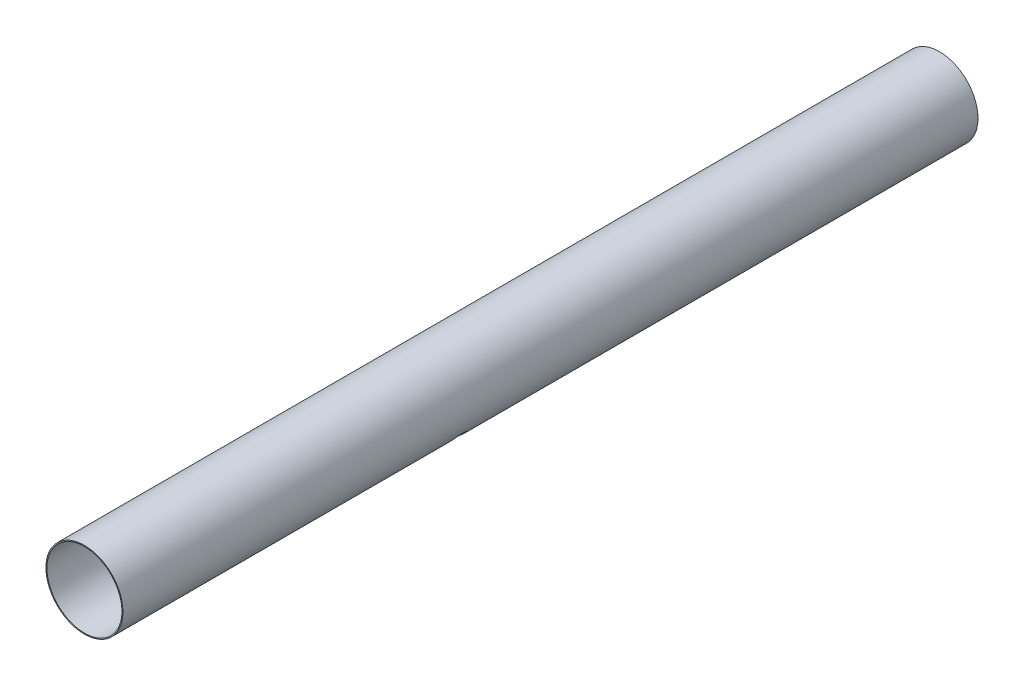
ISO-10303-21;
HEADER;
FILE_DESCRIPTION(('STEP AP214'),'2;1');
FILE_NAME('part.step','',(''),(''),'','','');
FILE_SCHEMA(('AUTOMOTIVE_DESIGN { 1 0 10303 214 1 1 1 1 }'));
ENDSEC;
DATA;
#1=APPLICATION_CONTEXT('core data for automotive mechanical design processes');
#2=APPLICATION_PROTOCOL_DEFINITION('international standard','automotive_design',2000,#1);
#3=PRODUCT_CONTEXT('',#1,'mechanical');
#4=PRODUCT('Part','Part','',(#3));
#5=PRODUCT_RELATED_PRODUCT_CATEGORY('part','',(#4));
#6=PRODUCT_DEFINITION_FORMATION('','',#4);
#7=PRODUCT_DEFINITION_CONTEXT('part definition',#1,'design');
#8=PRODUCT_DEFINITION('design','',#6,#7);
#9=PRODUCT_DEFINITION_SHAPE('','',#8);
#10=(LENGTH_UNIT() NAMED_UNIT(*) SI_UNIT(.MILLI.,.METRE.));
#11=(NAMED_UNIT(*) PLANE_ANGLE_UNIT() SI_UNIT($,.RADIAN.));
#12=(NAMED_UNIT(*) SI_UNIT($,.STERADIAN.) SOLID_ANGLE_UNIT());
#13=UNCERTAINTY_MEASURE_WITH_UNIT(LENGTH_MEASURE(1.E-05),#10,'distance_accuracy_value','');
#14=(GEOMETRIC_REPRESENTATION_CONTEXT(3) GLOBAL_UNCERTAINTY_ASSIGNED_CONTEXT((#13)) GLOBAL_UNIT_ASSIGNED_CONTEXT((#10,
#11,#12)) REPRESENTATION_CONTEXT('',''));
#15=CARTESIAN_POINT('',(0.,0.,0.));
#16=DIRECTION('',(0.,0.,1.));
#17=DIRECTION('',(1.,0.,0.));
#18=AXIS2_PLACEMENT_3D('',#15,#16,#17);
#19=CARTESIAN_POINT('',(0.,0.,1740.));
#20=DIRECTION('',(0.,0.,-1.));
#21=DIRECTION('',(-1.,0.,0.));
#22=AXIS2_PLACEMENT_3D('',#19,#20,#21);
#23=CYLINDRICAL_SURFACE('',#22,78.35);
#24=CARTESIAN_POINT('',(0.,0.,1740.));
#25=DIRECTION('',(0.,0.,1.));
#26=DIRECTION('',(1.,0.,0.));
#27=AXIS2_PLACEMENT_3D('',#24,#25,#26);
#28=CIRCLE('',#27,78.35);
#29=CARTESIAN_POINT('',(78.35,0.,1740.));
#30=VERTEX_POINT('',#29);
#31=EDGE_CURVE('E10',#30,#30,#28,.T.);
#32=ORIENTED_EDGE('',*,*,#31,.F.);
#33=EDGE_LOOP('',(#32));
#34=FACE_BOUND('',#33,.T.);
#35=CARTESIAN_POINT('',(0.,0.,0.));
#36=DIRECTION('',(0.,0.,1.));
#37=DIRECTION('',(1.,0.,0.));
#38=AXIS2_PLACEMENT_3D('',#35,#36,#37);
#39=CIRCLE('',#38,78.35);
#40=CARTESIAN_POINT('',(78.35,0.,0.));
#41=VERTEX_POINT('',#40);
#42=EDGE_CURVE('E44',#41,#41,#39,.T.);
#43=ORIENTED_EDGE('',*,*,#42,.T.);
#44=EDGE_LOOP('',(#43));
#45=FACE_BOUND('',#44,.T.);
#46=CARTESIAN_POINT('',(43.7704269799894,-64.9836304155855,1034.89));
#47=CARTESIAN_POINT('',(43.7704185873971,-64.9836330495455,1034.47274378583));
#48=CARTESIAN_POINT('',(43.7851471420884,-64.9737219518035,1034.05558703219));
#49=CARTESIAN_POINT('',(43.8438763845193,-64.9341078192532,1033.22415873229));
#50=CARTESIAN_POINT('',(43.8878822551469,-64.9044012801074,1032.80988771003));
#51=CARTESIAN_POINT('',(44.0047211961866,-64.8252416643284,1031.9870345879));
#52=CARTESIAN_POINT('',(44.0775760797465,-64.7757736455095,1031.5784570355));
#53=CARTESIAN_POINT('',(44.2512835874142,-64.6572304527577,1030.77021365579));
#54=CARTESIAN_POINT('',(44.3521350241034,-64.5881561103856,1030.3705474513));
#55=CARTESIAN_POINT('',(44.5806165403686,-64.4306630565429,1029.58328380249));
#56=CARTESIAN_POINT('',(44.7082210702476,-64.3422627982597,1029.1956752456));
#57=CARTESIAN_POINT('',(44.9889025976642,-64.1463203743606,1028.43478423851));
#58=CARTESIAN_POINT('',(45.1419798411203,-64.0387780239428,1028.06150192667));
#59=CARTESIAN_POINT('',(45.4720052838104,-63.8048596741469,1027.33182074178));
#60=CARTESIAN_POINT('',(45.6489512381604,-63.6784854458149,1026.97542028522));
#61=CARTESIAN_POINT('',(46.0249546498748,-63.4072532475293,1026.28183633831));
#62=CARTESIAN_POINT('',(46.22401226693,-63.2623951440836,1025.94465298677));
#63=CARTESIAN_POINT('',(46.6447482231952,-62.9528310910909,1025.2879311708));
#64=CARTESIAN_POINT('',(46.866662744575,-62.7879138793412,1024.96864356115));
#65=CARTESIAN_POINT('',(47.3290238003795,-62.4401286523775,1024.35417088082));
#66=CARTESIAN_POINT('',(47.5694704799832,-62.2572604965347,1024.05898599899));
#67=CARTESIAN_POINT('',(48.0666736530319,-61.8741937594589,1023.49470862881));
#68=CARTESIAN_POINT('',(48.3234312126405,-61.6739940450346,1023.22561784902));
#69=CARTESIAN_POINT('',(48.8509126361228,-61.2570309143429,1022.71540798926));
#70=CARTESIAN_POINT('',(49.1216365312667,-61.0402674609894,1022.47428897192));
#71=CARTESIAN_POINT('',(49.6768578962189,-60.5892828403475,1022.01991550933));
#72=CARTESIAN_POINT('',(49.9614480331917,-60.3549361732006,1021.80689875727));
#73=CARTESIAN_POINT('',(50.5398647024458,-59.8714175867554,1021.41257831312));
#74=CARTESIAN_POINT('',(50.8336912991311,-59.6222455640719,1021.23127484222));
#75=CARTESIAN_POINT('',(51.4280088291381,-59.1103728987661,1020.9017646628));
#76=CARTESIAN_POINT('',(51.7284993191694,-58.8476731544965,1020.75355576001));
#77=CARTESIAN_POINT('',(52.3335995984996,-58.3102099300419,1020.49137426413));
#78=CARTESIAN_POINT('',(52.6382093327444,-58.0354466109777,1020.37740121395));
#79=CARTESIAN_POINT('',(53.245308675188,-57.4789275572815,1020.18576577491));
#80=CARTESIAN_POINT('',(53.547779331399,-57.197296678722,1020.10768066527));
#81=CARTESIAN_POINT('',(54.1518585249759,-56.6257150790329,1019.98642797146));
#82=CARTESIAN_POINT('',(54.4534670685888,-56.3357644183578,1019.94326013364));
#83=CARTESIAN_POINT('',(55.0534780831228,-55.7495555996889,1019.89219125522));
#84=CARTESIAN_POINT('',(55.3518808015405,-55.4532979339519,1019.88428747235));
#85=CARTESIAN_POINT('',(55.9432971276282,-54.8565990368764,1019.90380344009));
#86=CARTESIAN_POINT('',(56.2363107736518,-54.5561578353385,1019.93122293921));
#87=CARTESIAN_POINT('',(56.8111014170381,-53.9573096530345,1020.02057391802));
#88=CARTESIAN_POINT('',(57.092975243934,-53.658927441316,1020.08204943961));
#89=CARTESIAN_POINT('',(57.6476434795243,-53.0625812387903,1020.23870859702));
#90=CARTESIAN_POINT('',(57.9204379804708,-52.7646172437633,1020.33389189025));
#91=CARTESIAN_POINT('',(58.4553102185501,-52.1714358133198,1020.55724022727));
#92=CARTESIAN_POINT('',(58.7173876906627,-51.8762184459636,1020.68540608612));
#93=CARTESIAN_POINT('',(59.2293587223791,-51.2909033059705,1020.97375915673));
#94=CARTESIAN_POINT('',(59.4792521727391,-51.0008055792519,1021.13394665554));
#95=CARTESIAN_POINT('',(59.9669944206552,-50.4264303080915,1021.48620002339));
#96=CARTESIAN_POINT('',(60.2047644088533,-50.1421966141301,1021.67844649017));
#97=CARTESIAN_POINT('',(60.665559351662,-49.5837018978869,1022.0927734451));
#98=CARTESIAN_POINT('',(60.8885842723433,-49.3094408985535,1022.3148540019));
#99=CARTESIAN_POINT('',(61.3189526135695,-48.7732177545314,1022.78731940969));
#100=CARTESIAN_POINT('',(61.5262946367326,-48.511256706583,1023.03770677794));
#101=CARTESIAN_POINT('',(61.9244690796638,-48.0019493216069,1023.56506316975));
#102=CARTESIAN_POINT('',(62.11530131504,-47.7546031478173,1023.84203249012));
#103=CARTESIAN_POINT('',(62.48269425138,-47.2729166797975,1024.42533107783));
#104=CARTESIAN_POINT('',(62.6589777936026,-47.0388477603642,1024.73205916109));
#105=CARTESIAN_POINT('',(62.9932060883876,-46.5903073447042,1025.36894660709));
#106=CARTESIAN_POINT('',(63.1511506356771,-46.3758360678444,1025.69910623204));
#107=CARTESIAN_POINT('',(63.4482057053387,-45.9685897220004,1026.38061505639));
#108=CARTESIAN_POINT('',(63.5873158241913,-45.7758151178731,1026.73196470955));
#109=CARTESIAN_POINT('',(63.8462817978858,-45.413922227383,1027.45344340361));
#110=CARTESIAN_POINT('',(63.966137724388,-45.2448038529769,1027.82357237462));
#111=CARTESIAN_POINT('',(64.1864541208828,-44.9317075208343,1028.58075356351));
#112=CARTESIAN_POINT('',(64.286878326303,-44.7877766163121,1028.96783580128));
#113=CARTESIAN_POINT('',(64.4677699594066,-44.527006845484,1029.75555842047));
#114=CARTESIAN_POINT('',(64.5482373263192,-44.4101680616766,1030.15619884318));
#115=CARTESIAN_POINT('',(64.6889807584611,-44.2049066248782,1030.96812481877));
#116=CARTESIAN_POINT('',(64.7492587836656,-44.1164812135593,1031.37940933416));
#117=CARTESIAN_POINT('',(64.8494628526782,-43.969053071203,1032.20965875243));
#118=CARTESIAN_POINT('',(64.889389194602,-43.9100499091825,1032.62862354273));
#119=CARTESIAN_POINT('',(64.9483106087706,-43.8228499087805,1033.46451418495));
#120=CARTESIAN_POINT('',(64.967624677493,-43.7941836355311,1033.88136865493));
#121=CARTESIAN_POINT('',(64.9863732776753,-43.7663577942352,1034.71650533041));
#122=CARTESIAN_POINT('',(64.9858080161588,-43.7671979189085,1035.13478752099));
#123=CARTESIAN_POINT('',(64.9648003499233,-43.798373998858,1035.9697284803));
#124=CARTESIAN_POINT('',(64.944358911118,-43.8287085208083,1036.38638732694));
#125=CARTESIAN_POINT('',(64.8836569747425,-43.9185210146455,1037.21509276142));
#126=CARTESIAN_POINT('',(64.8433965141776,-43.9779989321169,1037.62713935787));
#127=CARTESIAN_POINT('',(64.7436038359295,-44.1247782156928,1038.44011964087));
#128=CARTESIAN_POINT('',(64.6842421075908,-44.2118333370536,1038.84111877799));
#129=CARTESIAN_POINT('',(64.5463126688734,-44.4129584097913,1039.6329024085));
#130=CARTESIAN_POINT('',(64.4677451038635,-44.5270281566947,1040.02368697919));
#131=CARTESIAN_POINT('',(64.2916098179147,-44.780969918088,1040.79240025617));
#132=CARTESIAN_POINT('',(64.1940409875417,-44.9208434391676,1041.17032821029));
#133=CARTESIAN_POINT('',(63.9801690916804,-45.2249377742064,1041.91077321018));
#134=CARTESIAN_POINT('',(63.8638657949113,-45.3891588887397,1042.27329006562));
#135=CARTESIAN_POINT('',(63.6113369759639,-45.742409103598,1042.98476310828));
#136=CARTESIAN_POINT('',(63.4748890542312,-45.9317123499956,1043.33350426041));
#137=CARTESIAN_POINT('',(63.183531309086,-46.3316853279084,1044.01041350401));
#138=CARTESIAN_POINT('',(63.0286213599965,-46.5423552048715,1044.33858145541));
#139=CARTESIAN_POINT('',(62.7008011967971,-46.9830547317894,1044.97218364948));
#140=CARTESIAN_POINT('',(62.5278895002713,-47.2130859758234,1045.27761601636));
#141=CARTESIAN_POINT('',(62.164643889968,-47.6903497719131,1045.86367680086));
#142=CARTESIAN_POINT('',(61.9743098424962,-47.9375824559646,1046.14430502811));
#143=CARTESIAN_POINT('',(61.5741140011588,-48.450575454638,1046.68260390098));
#144=CARTESIAN_POINT('',(61.3640161995441,-48.7165466369921,1046.93989830056));
#145=CARTESIAN_POINT('',(60.9274463683985,-49.2614518269188,1047.42521369087));
#146=CARTESIAN_POINT('',(60.7009741656431,-49.5403859716152,1047.65323437183));
#147=CARTESIAN_POINT('',(60.2326658587224,-50.1087219554688,1048.07834258799));
#148=CARTESIAN_POINT('',(59.9908301565177,-50.3981235206779,1048.27543093201));
#149=CARTESIAN_POINT('',(59.4929730978826,-50.9848669652262,1048.63721155927));
#150=CARTESIAN_POINT('',(59.2369518744444,-51.2822087701104,1048.80190414616));
#151=CARTESIAN_POINT('',(58.7135189146999,-51.8806549233496,1049.09683237367));
#152=CARTESIAN_POINT('',(58.4461762930448,-52.1817302143447,1049.22724960319));
#153=CARTESIAN_POINT('',(57.9003697360255,-52.7866994543221,1049.45377518911));
#154=CARTESIAN_POINT('',(57.6219058232164,-53.0905933975869,1049.54988361509));
#155=CARTESIAN_POINT('',(57.0556335485241,-53.6986942847747,1049.70701823441));
#156=CARTESIAN_POINT('',(56.7678260491143,-54.0029011973127,1049.76804765611));
#157=CARTESIAN_POINT('',(56.1847831404379,-54.6092439673635,1049.85454247988));
#158=CARTESIAN_POINT('',(55.8895478213747,-54.9113798499702,1049.88000831364));
#159=CARTESIAN_POINT('',(55.2985208269948,-55.5064784673629,1049.89504850272));
#160=CARTESIAN_POINT('',(55.0028133338795,-55.7995106403069,1049.88518955052));
#161=CARTESIAN_POINT('',(54.4083996751838,-56.3792594897203,1049.8309143007));
#162=CARTESIAN_POINT('',(54.109693543779,-56.6659762380481,1049.78649839648));
#163=CARTESIAN_POINT('',(53.5115427939242,-57.2311681035575,1049.66346097936));
#164=CARTESIAN_POINT('',(53.2120981868208,-57.5096433465259,1049.58483998881));
#165=CARTESIAN_POINT('',(52.6147982971133,-58.0566059677918,1049.39400422158));
#166=CARTESIAN_POINT('',(52.3169430203181,-58.3250933096052,1049.28178932221));
#167=CARTESIAN_POINT('',(51.7257759733395,-58.8500005667144,1049.02487128859));
#168=CARTESIAN_POINT('',(51.4324565260323,-59.1064428294011,1048.88023144578));
#169=CARTESIAN_POINT('',(50.8521555713531,-59.6064382243742,1048.55941406077));
#170=CARTESIAN_POINT('',(50.5651740448707,-59.8499913955278,1048.38323661367));
#171=CARTESIAN_POINT('',(49.9999059203313,-60.3230284209334,1048.0006042255));
#172=CARTESIAN_POINT('',(49.7216197760019,-60.5525115416054,1047.79414770765));
#173=CARTESIAN_POINT('',(49.176097847303,-60.9963734755033,1047.35241114154));
#174=CARTESIAN_POINT('',(48.908862195132,-61.210752108054,1047.11713074859));
#175=CARTESIAN_POINT('',(48.3838536068781,-61.6266097850768,1046.61564708244));
#176=CARTESIAN_POINT('',(48.1262807392163,-61.8278493137863,1046.34903564299));
#177=CARTESIAN_POINT('',(47.6272042768601,-62.2131120952495,1045.78961681325));
#178=CARTESIAN_POINT('',(47.3857008790353,-62.3971351370924,1045.49680910213));
#179=CARTESIAN_POINT('',(46.9209475252783,-62.7473656081468,1044.88691462706));
#180=CARTESIAN_POINT('',(46.6977018791185,-62.913568833824,1044.56982216466));
#181=CARTESIAN_POINT('',(46.2716602648854,-63.2275731561657,1043.91356017449));
#182=CARTESIAN_POINT('',(46.068864135551,-63.3753743979471,1043.57439082084));
#183=CARTESIAN_POINT('',(45.6838482919443,-63.6534796786702,1042.87285045492));
#184=CARTESIAN_POINT('',(45.5018484396779,-63.7835990997252,1042.51028549335));
#185=CARTESIAN_POINT('',(45.1626286266663,-64.0242355518478,1041.76748997904));
#186=CARTESIAN_POINT('',(45.0054086126821,-64.1347526250306,1041.38725946427));
#187=CARTESIAN_POINT('',(44.7175567944082,-64.335786715727,1040.61210047453));
#188=CARTESIAN_POINT('',(44.5869033089367,-64.4263200473564,1040.21718429858));
#189=CARTESIAN_POINT('',(44.3535033462876,-64.5872221257257,1039.4153232428));
#190=CARTESIAN_POINT('',(44.250751304257,-64.6575948935794,1039.00838077955));
#191=CARTESIAN_POINT('',(44.0329706670176,-64.8062118515977,1037.99239799378));
#192=CARTESIAN_POINT('',(43.9347109637275,-64.872720213305,1037.37792555308));
#193=CARTESIAN_POINT('',(43.8034463565135,-64.961426874592,1036.13889431718));
#194=CARTESIAN_POINT('',(43.7704395377316,-64.9836264744206,1035.51433581849));
#195=CARTESIAN_POINT('',(43.7704269799894,-64.9836304155855,1034.89));
#196=B_SPLINE_CURVE_WITH_KNOTS('',3,(#46,#47,#48,#49,#50,#51,#52,#53,#54,#55,#56,#57,#58,#59,
#60,#61,#62,#63,#64,#65,#66,#67,#68,#69,#70,#71,#72,#73,#74,#75,#76,#77,#78,#79,#80,#81,#82,#83,
#84,#85,#86,#87,#88,#89,#90,#91,#92,#93,#94,#95,#96,#97,#98,#99,#100,#101,#102,#103,#104,#105,
#106,#107,#108,#109,#110,#111,#112,#113,#114,#115,#116,#117,#118,#119,#120,#121,#122,#123,#124,
#125,#126,#127,#128,#129,#130,#131,#132,#133,#134,#135,#136,#137,#138,#139,#140,#141,#142,#143,
#144,#145,#146,#147,#148,#149,#150,#151,#152,#153,#154,#155,#156,#157,#158,#159,#160,#161,#162,
#163,#164,#165,#166,#167,#168,#169,#170,#171,#172,#173,#174,#175,#176,#177,#178,#179,#180,#181,
#182,#183,#184,#185,#186,#187,#188,#189,#190,#191,#192,#193,#194,#195),.UNSPECIFIED.,.T.,.F.,(4,
2,2,2,2,2,2,2,2,2,2,2,2,2,2,2,2,2,2,2,2,2,2,2,2,2,2,2,2,2,2,2,2,2,2,2,2,2,2,2,2,2,2,2,2,2,2,2,2,
2,2,2,2,2,2,2,2,2,2,2,2,2,2,2,2,2,2,2,2,2,2,2,2,2,4),(0.,1.2512201815193,2.50266192228976,
3.75505170827783,5.00738838473607,6.2585344605956,7.50969261595667,8.76073318017256,
10.0117827800136,11.2773839703529,12.5429950762847,13.8086889944019,15.0743857464918,
16.3501819344891,17.6259870203369,18.9017074911477,20.1774109286545,21.437676508019,
22.697932932161,23.9580913523073,25.2182408005425,26.4619128488018,27.7055722566655,
28.9492624002594,30.1929636929127,31.4439236975604,32.6948865806336,33.9459607963562,
35.1970489830685,36.4681521948668,37.7392696330668,39.0104143001138,40.2815542361177,
41.5550440363454,42.8285377144412,44.101907726298,45.3752590850323,46.628604785677,
47.8819374339598,49.1352091776409,50.3884785812648,51.630858488083,52.8732289916391,
54.1156720557237,55.3581304592032,56.6155042039001,57.8728865084241,59.1303724384454,
60.3878680188794,61.6629618753457,62.9380692229775,64.2131432232563,65.4882052714666,
66.7563693490939,68.0245308548904,69.2925756321626,70.5606050177479,71.8083839600148,
73.0561486973931,74.3038943808019,75.5516446215911,76.796980217044,78.0423120569617,
79.2877087704915,80.5331203785421,81.7970703887685,83.0610358810033,84.3252988783539,
85.5895519051794,86.8661295257231,88.1427044035287,89.4182332382843,90.6935074857546,
92.5657492272819,94.4379360267141),.UNSPECIFIED.);
#197=CARTESIAN_POINT('',(43.7704269799894,-64.9836304155855,1034.89));
#198=VERTEX_POINT('',#197);
#199=EDGE_CURVE('E54',#198,#198,#196,.T.);
#200=ORIENTED_EDGE('',*,*,#199,.F.);
#201=EDGE_LOOP('',(#200));
#202=FACE_BOUND('',#201,.T.);
#203=ADVANCED_FACE('F31',(#34,#45,#202),#23,.T.);
#204=CARTESIAN_POINT('',(0.,0.,1740.));
#205=DIRECTION('',(0.,0.,-1.));
#206=DIRECTION('',(-1.,0.,0.));
#207=AXIS2_PLACEMENT_3D('',#204,#205,#206);
#208=CYLINDRICAL_SURFACE('',#207,76.35);
#209=CARTESIAN_POINT('',(0.,0.,0.));
#210=DIRECTION('',(0.,0.,1.));
#211=DIRECTION('',(1.,0.,0.));
#212=AXIS2_PLACEMENT_3D('',#209,#210,#211);
#213=CIRCLE('',#212,76.35);
#214=CARTESIAN_POINT('',(76.35,0.,0.));
#215=VERTEX_POINT('',#214);
#216=EDGE_CURVE('E51',#215,#215,#213,.T.);
#217=ORIENTED_EDGE('',*,*,#216,.F.);
#218=EDGE_LOOP('',(#217));
#219=FACE_BOUND('',#218,.T.);
#220=CARTESIAN_POINT('',(0.,0.,1740.));
#221=DIRECTION('',(0.,0.,1.));
#222=DIRECTION('',(1.,0.,0.));
#223=AXIS2_PLACEMENT_3D('',#220,#221,#222);
#224=CIRCLE('',#223,76.35);
#225=CARTESIAN_POINT('',(76.35,0.,1740.));
#226=VERTEX_POINT('',#225);
#227=EDGE_CURVE('E49',#226,#226,#224,.T.);
#228=ORIENTED_EDGE('',*,*,#227,.T.);
#229=EDGE_LOOP('',(#228));
#230=FACE_BOUND('',#229,.T.);
#231=CARTESIAN_POINT('',(42.3288424571591,-63.5420458927552,1034.89));
#232=CARTESIAN_POINT('',(42.3288336539238,-63.5420485564455,1034.47296654523));
#233=CARTESIAN_POINT('',(42.3436122176271,-63.532213521062,1034.05603523828));
#234=CARTESIAN_POINT('',(42.4025378488622,-63.4929022984525,1033.22505952206));
#235=CARTESIAN_POINT('',(42.4466899800212,-63.4634227247581,1032.81101562298));
#236=CARTESIAN_POINT('',(42.5639098953501,-63.3848642513507,1031.98862603803));
#237=CARTESIAN_POINT('',(42.636999032437,-63.3357708781672,1031.5802847911));
#238=CARTESIAN_POINT('',(42.8112521229423,-63.2181163576276,1030.77251242365));
#239=CARTESIAN_POINT('',(42.9124149220014,-63.1495560107301,1030.37308093751));
#240=CARTESIAN_POINT('',(43.1415786168602,-62.9932210162271,1029.58629182318));
#241=CARTESIAN_POINT('',(43.2695531859946,-62.9054652130789,1029.19892277623));
#242=CARTESIAN_POINT('',(43.5510203383731,-62.7109270806973,1028.43849829647));
#243=CARTESIAN_POINT('',(43.7045131596169,-62.604144574008,1028.0654429972));
#244=CARTESIAN_POINT('',(44.035400589294,-62.371843261396,1027.33619154237));
#245=CARTESIAN_POINT('',(44.212793142929,-62.246326066103,1026.97999394101));
#246=CARTESIAN_POINT('',(44.5897042355703,-61.976886174375,1026.28678470962));
#247=CARTESIAN_POINT('',(44.7892229469433,-61.8329633345556,1025.94977322909));
#248=CARTESIAN_POINT('',(45.2110158592172,-61.5252428146595,1025.29315491117));
#249=CARTESIAN_POINT('',(45.4335388277896,-61.3612233080317,1024.97381178623));
#250=CARTESIAN_POINT('',(45.8971250548548,-61.0152443430517,1024.35920716067));
#251=CARTESIAN_POINT('',(46.1381884651659,-60.8332847377937,1024.06394585729));
#252=CARTESIAN_POINT('',(46.6366180204691,-60.4520205628719,1023.49948985703));
#253=CARTESIAN_POINT('',(46.8939852587552,-60.2527148296841,1023.2302969113));
#254=CARTESIAN_POINT('',(47.4226638583144,-59.837500006198,1022.719855102));
#255=CARTESIAN_POINT('',(47.6939752529058,-59.6215908762265,1022.4786063052));
#256=CARTESIAN_POINT('',(48.2504626140253,-59.1721583319299,1022.02384440583));
#257=CARTESIAN_POINT('',(48.5357360947027,-58.9385018982928,1021.81058197381));
#258=CARTESIAN_POINT('',(49.1154761186338,-58.4562626922391,1021.41577289479));
#259=CARTESIAN_POINT('',(49.4099427294988,-58.2076798100325,1021.2342264811));
#260=CARTESIAN_POINT('',(50.0054789407089,-57.6968668406585,1020.90423993822));
#261=CARTESIAN_POINT('',(50.3065480784085,-57.4346377079404,1020.75579749749));
#262=CARTESIAN_POINT('',(50.9127286998064,-56.8979823464267,1020.49316477058));
#263=CARTESIAN_POINT('',(51.2178401265214,-56.6235562894402,1020.3789740021));
#264=CARTESIAN_POINT('',(51.8256535553264,-56.0677407912831,1020.18698872131));
#265=CARTESIAN_POINT('',(52.1283368068247,-55.7864844092283,1020.10874952477));
#266=CARTESIAN_POINT('',(52.7327396678545,-55.2155184581606,1019.98717205734));
#267=CARTESIAN_POINT('',(53.0344592847324,-54.9258089537642,1019.94383351973));
#268=CARTESIAN_POINT('',(53.6345824414009,-54.3399475174958,1019.8924102652));
#269=CARTESIAN_POINT('',(53.9329862499783,-54.0437961136601,1019.88432266966));
#270=CARTESIAN_POINT('',(54.5242914416014,-53.4471752082684,1019.90345957306));
#271=CARTESIAN_POINT('',(54.8171928659525,-53.1467057391572,1019.93068380683));
#272=CARTESIAN_POINT('',(55.3914472543818,-52.5478810445256,1020.01960458736));
#273=CARTESIAN_POINT('',(55.6729036902642,-52.2495536564665,1020.08082141578));
#274=CARTESIAN_POINT('',(56.2266430811034,-51.6531962222664,1020.23690406699));
#275=CARTESIAN_POINT('',(56.4989261342167,-51.3551661729767,1020.33176952961));
#276=CARTESIAN_POINT('',(57.0326923000193,-50.761735541596,1020.55442281016));
#277=CARTESIAN_POINT('',(57.2941751366319,-50.4663350268727,1020.68221146908));
#278=CARTESIAN_POINT('',(57.8048878295276,-49.8805418767601,1020.96975086051));
#279=CARTESIAN_POINT('',(58.0541175707567,-49.5901492884107,1021.12950189306));
#280=CARTESIAN_POINT('',(58.5405411244166,-49.0150005223418,1021.48086816075));
#281=CARTESIAN_POINT('',(58.7776522175553,-48.7302895482407,1021.67267187533));
#282=CARTESIAN_POINT('',(59.2370896375661,-48.1707460750691,1022.08607326296));
#283=CARTESIAN_POINT('',(59.4594159290999,-47.8959135996108,1022.30767100721));
#284=CARTESIAN_POINT('',(59.8883701141994,-47.3584614533789,1022.7791361367));
#285=CARTESIAN_POINT('',(60.0949965384616,-47.095842926562,1023.02900616241));
#286=CARTESIAN_POINT('',(60.491745114801,-46.5851462732252,1023.55529935658));
#287=CARTESIAN_POINT('',(60.6818670729824,-46.3370683175403,1023.83172283691));
#288=CARTESIAN_POINT('',(61.0480101713659,-45.8536416937393,1024.41414499517));
#289=CARTESIAN_POINT('',(61.2237399323402,-45.618577743924,1024.72056333525));
#290=CARTESIAN_POINT('',(61.5568839387473,-45.1680314108901,1025.35686040763));
#291=CARTESIAN_POINT('',(61.7142979685916,-44.9525492581688,1025.686739416));
#292=CARTESIAN_POINT('',(62.0103373382148,-44.5432865030354,1026.36772417932));
#293=CARTESIAN_POINT('',(62.1489622393791,-44.3495064072557,1026.71883042952));
#294=CARTESIAN_POINT('',(62.4070227801855,-43.9856315380047,1027.43986621225));
#295=CARTESIAN_POINT('',(62.5264584935591,-43.815536673527,1027.80979567244));
#296=CARTESIAN_POINT('',(62.7460361079008,-43.5005105146852,1028.56669543617));
#297=CARTESIAN_POINT('',(62.8461383955898,-43.3556309440419,1028.95369877256));
#298=CARTESIAN_POINT('',(63.0264769812163,-43.0930515109668,1029.74132236013));
#299=CARTESIAN_POINT('',(63.1067132143988,-42.9753517371299,1030.1419426557));
#300=CARTESIAN_POINT('',(63.2470965254677,-42.7684804854746,1030.95388421002));
#301=CARTESIAN_POINT('',(63.3072456660285,-42.6793060785239,1031.36520436536));
#302=CARTESIAN_POINT('',(63.4073032671892,-42.5305119511955,1032.19557893844));
#303=CARTESIAN_POINT('',(63.4472120413255,-42.470891773004,1032.61463323628));
#304=CARTESIAN_POINT('',(63.5061901118227,-42.3826507725987,1033.45040248188));
#305=CARTESIAN_POINT('',(63.5255929920243,-42.3535338038828,1033.86704158925));
#306=CARTESIAN_POINT('',(63.5446675899921,-42.3249101805471,1034.70178427859));
#307=CARTESIAN_POINT('',(63.5443395239666,-42.3254032014661,1035.11988784446));
#308=CARTESIAN_POINT('',(63.5239539477439,-42.3559925958852,1035.95450497532));
#309=CARTESIAN_POINT('',(63.5038974488346,-42.3860874519825,1036.37101862072));
#310=CARTESIAN_POINT('',(63.4441094100806,-42.4755266886632,1037.19946604246));
#311=CARTESIAN_POINT('',(63.4043779100088,-42.5348710101189,1037.61139982806));
#312=CARTESIAN_POINT('',(63.3058016697825,-42.6814442812974,1038.42396810038));
#313=CARTESIAN_POINT('',(63.247136606533,-42.7684109799993,1038.82467176286));
#314=CARTESIAN_POINT('',(63.1107461734953,-42.9694188231453,1039.61590836076));
#315=CARTESIAN_POINT('',(63.03302095654,-43.0834597504957,1040.00644137771));
#316=CARTESIAN_POINT('',(62.8587028078844,-43.3373935640812,1040.77470369753));
#317=CARTESIAN_POINT('',(62.7621087256383,-43.4772880267305,1041.15243221799));
#318=CARTESIAN_POINT('',(62.5503026795481,-43.7814625248292,1041.89253848755));
#319=CARTESIAN_POINT('',(62.4350904744318,-43.9457428762929,1042.25491603765));
#320=CARTESIAN_POINT('',(62.1847802443462,-44.2992446803814,1042.96639104521));
#321=CARTESIAN_POINT('',(62.0494498927403,-44.4887543788096,1043.31526356799));
#322=CARTESIAN_POINT('',(61.7603826125016,-44.8891812374583,1043.99249265788));
#323=CARTESIAN_POINT('',(61.6066455527208,-45.1000985502065,1044.32084907878));
#324=CARTESIAN_POINT('',(61.281201455133,-45.5413216617855,1044.95489351931));
#325=CARTESIAN_POINT('',(61.1094928559614,-45.7716291448907,1045.26057956539));
#326=CARTESIAN_POINT('',(60.7486580009263,-46.2494612080313,1045.84721709159));
#327=CARTESIAN_POINT('',(60.5595316034454,-46.4969859280494,1046.12816837058));
#328=CARTESIAN_POINT('',(60.1615869573199,-47.0107760779635,1046.66740571356));
#329=CARTESIAN_POINT('',(59.9525187717516,-47.2772645908144,1046.92529496036));
#330=CARTESIAN_POINT('',(59.5179308117106,-47.8232174075751,1047.41182905593));
#331=CARTESIAN_POINT('',(59.292410853525,-48.1026818563712,1047.64047357806));
#332=CARTESIAN_POINT('',(58.8259045254723,-48.6720750393765,1048.06685284866));
#333=CARTESIAN_POINT('',(58.584918572103,-48.962003491699,1048.26458842902));
#334=CARTESIAN_POINT('',(58.0886356052735,-49.5497813648348,1048.62767941357));
#335=CARTESIAN_POINT('',(57.8333387323652,-49.8476307078394,1048.7930351357));
#336=CARTESIAN_POINT('',(57.3112583298601,-50.4469941359019,1049.08926313746));
#337=CARTESIAN_POINT('',(57.0445472569213,-50.7484782967052,1049.22032362371));
#338=CARTESIAN_POINT('',(56.499850360969,-51.3542139772541,1049.44814621136));
#339=CARTESIAN_POINT('',(56.2218645613072,-51.6584654912672,1049.54490838379));
#340=CARTESIAN_POINT('',(55.6563860370619,-52.2672148919484,1049.70335104036));
#341=CARTESIAN_POINT('',(55.3688942385607,-52.5717127518143,1049.76503493125));
#342=CARTESIAN_POINT('',(54.7863137593589,-53.1785598290897,1049.85283148018));
#343=CARTESIAN_POINT('',(54.491225176244,-53.4809090740359,1049.87894459491));
#344=CARTESIAN_POINT('',(53.9005724521448,-54.0760909628466,1049.89524829004));
#345=CARTESIAN_POINT('',(53.6050997135295,-54.3689981426528,1049.88603542769));
#346=CARTESIAN_POINT('',(53.0109992790246,-54.9484178330735,1049.8330935389));
#347=CARTESIAN_POINT('',(52.7123716209832,-55.2349304202729,1049.78936492606));
#348=CARTESIAN_POINT('',(52.1142234831868,-55.7996360844626,1049.66773981051));
#349=CARTESIAN_POINT('',(51.8147030183191,-56.0778292993301,1049.58984387438));
#350=CARTESIAN_POINT('',(51.2171007438816,-56.6241556588227,1049.40049329962));
#351=CARTESIAN_POINT('',(50.9190189397292,-56.8922887655922,1049.28903853471));
#352=CARTESIAN_POINT('',(50.3273154633459,-57.4163713200763,1049.03369827616));
#353=CARTESIAN_POINT('',(50.0336856116654,-57.6723456124036,1048.88988269327));
#354=CARTESIAN_POINT('',(49.4526239861679,-58.1713603133154,1048.5707566181));
#355=CARTESIAN_POINT('',(49.1651921921893,-58.4144007639761,1048.3954462283));
#356=CARTESIAN_POINT('',(48.5988892093983,-58.8863852006235,1048.01458545419));
#357=CARTESIAN_POINT('',(48.320018500656,-59.1153283968158,1047.8090333778));
#358=CARTESIAN_POINT('',(47.7732018839514,-59.558101637529,1047.36913714859));
#359=CARTESIAN_POINT('',(47.50525611362,-59.7719314916787,1047.1347926332));
#360=CARTESIAN_POINT('',(46.9785081703595,-60.1868460706167,1046.63503626844));
#361=CARTESIAN_POINT('',(46.7199141234825,-60.3876796246687,1046.3691964207));
#362=CARTESIAN_POINT('',(46.2187106120806,-60.7721405809754,1045.81129605424));
#363=CARTESIAN_POINT('',(45.9761013494476,-60.9557677659217,1045.51923520444));
#364=CARTESIAN_POINT('',(45.5090688348321,-61.3052384314001,1044.91080011897));
#365=CARTESIAN_POINT('',(45.2846498789713,-61.4710777138214,1044.59442017386));
#366=CARTESIAN_POINT('',(44.8562140038624,-61.7844075939655,1043.93953738024));
#367=CARTESIAN_POINT('',(44.6521969349221,-61.9318983263166,1043.60103469406));
#368=CARTESIAN_POINT('',(44.2645833014453,-62.2095379428879,1042.90056278909));
#369=CARTESIAN_POINT('',(44.0812201977184,-62.3394913293878,1042.53838678349));
#370=CARTESIAN_POINT('',(43.7393032546778,-62.5798652995366,1041.79627873894));
#371=CARTESIAN_POINT('',(43.5807493568686,-62.6902859292405,1041.41634674185));
#372=CARTESIAN_POINT('',(43.2902868001351,-62.8912138107887,1040.6416826105));
#373=CARTESIAN_POINT('',(43.1583567883147,-62.9817370260028,1040.24696264019));
#374=CARTESIAN_POINT('',(42.9224910232519,-63.1427159562982,1039.44539542606));
#375=CARTESIAN_POINT('',(42.8185497842227,-63.2131756039855,1039.0385505761));
#376=CARTESIAN_POINT('',(42.5969448467736,-63.3628343351155,1038.01794025946));
#377=CARTESIAN_POINT('',(42.4966104813549,-63.4300163107631,1037.39852180026));
#378=CARTESIAN_POINT('',(42.3625670058309,-63.5196193570484,1036.14932441143));
#379=CARTESIAN_POINT('',(42.3288557463566,-63.5420418716987,1035.5195458167));
#380=CARTESIAN_POINT('',(42.3288424571591,-63.5420458927552,1034.89));
#381=B_SPLINE_CURVE_WITH_KNOTS('',3,(#231,#232,#233,#234,#235,#236,#237,#238,#239,#240,#241,
#242,#243,#244,#245,#246,#247,#248,#249,#250,#251,#252,#253,#254,#255,#256,#257,#258,#259,#260,
#261,#262,#263,#264,#265,#266,#267,#268,#269,#270,#271,#272,#273,#274,#275,#276,#277,#278,#279,
#280,#281,#282,#283,#284,#285,#286,#287,#288,#289,#290,#291,#292,#293,#294,#295,#296,#297,#298,
#299,#300,#301,#302,#303,#304,#305,#306,#307,#308,#309,#310,#311,#312,#313,#314,#315,#316,#317,
#318,#319,#320,#321,#322,#323,#324,#325,#326,#327,#328,#329,#330,#331,#332,#333,#334,#335,#336,
#337,#338,#339,#340,#341,#342,#343,#344,#345,#346,#347,#348,#349,#350,#351,#352,#353,#354,#355,
#356,#357,#358,#359,#360,#361,#362,#363,#364,#365,#366,#367,#368,#369,#370,#371,#372,#373,#374,
#375,#376,#377,#378,#379,#380),.UNSPECIFIED.,.T.,.F.,(4,2,2,2,2,2,2,2,2,2,2,2,2,2,2,2,2,2,2,2,2,
2,2,2,2,2,2,2,2,2,2,2,2,2,2,2,2,2,2,2,2,2,2,2,2,2,2,2,2,2,2,2,2,2,2,2,2,2,2,2,2,2,2,2,2,2,2,2,2,
2,2,2,2,2,4),(0.,1.25054711247673,2.50130985914895,3.75299728199932,5.00463324440605,
6.25504592876201,7.50547027592491,8.75578718539468,10.0061138357375,11.2717537127441,
12.5374039545372,13.8031391577041,15.0688773853859,16.3452744163883,17.6216808369455,
18.8979981024558,20.1742973951186,21.4343545493342,22.694402074057,23.9543467002134,
25.2142818644085,26.4568722811265,27.6994493977259,28.942058257631,30.184678783135,
31.4348814604463,32.6850871258643,33.9354096505276,35.185746862099,36.4571400940154,
37.7285482895671,38.9999861598373,40.2714191446939,41.5454302237122,42.8194454554184,
44.0933298226167,45.3671944559122,46.6200013248609,47.8727944657718,49.1255233913126,
50.3782497844802,51.6194212859292,52.8605828354275,54.1018200894933,55.3430734300372,
56.5999706847694,57.8568768954309,59.1138923966959,60.3709181191805,61.6465410240868,
62.9221781757375,64.1977809890078,65.4733712763869,66.7418071212876,68.0102403391896,
69.278550347261,70.5468440712039,71.7938149402442,73.0407708669121,74.2877061162846,
75.5346460573336,76.778917600623,78.0231850958271,79.2675222374357,80.5118750502166,
81.7756595717325,83.0394600521048,84.3035581478894,85.5676469680842,86.8448321235356,
88.1220142675643,89.3981679786603,90.6740713818428,92.5619345599418,94.4497368315326),.UNSPECIFIED.);
#382=CARTESIAN_POINT('',(42.3288424571591,-63.5420458927552,1034.89));
#383=VERTEX_POINT('',#382);
#384=EDGE_CURVE('E35',#383,#383,#381,.T.);
#385=ORIENTED_EDGE('',*,*,#384,.T.);
#386=EDGE_LOOP('',(#385));
#387=FACE_BOUND('',#386,.T.);
#388=ADVANCED_FACE('F66',(#219,#230,#387),#208,.F.);
#389=CARTESIAN_POINT('',(0.,0.,1740.));
#390=DIRECTION('',(0.,0.,1.));
#391=DIRECTION('',(1.,0.,0.));
#392=AXIS2_PLACEMENT_3D('',#389,#390,#391);
#393=PLANE('',#392);
#394=ORIENTED_EDGE('',*,*,#31,.T.);
#395=EDGE_LOOP('',(#394));
#396=FACE_BOUND('',#395,.T.);
#397=ORIENTED_EDGE('',*,*,#227,.F.);
#398=EDGE_LOOP('',(#397));
#399=FACE_BOUND('',#398,.T.);
#400=ADVANCED_FACE('F71',(#396,#399),#393,.T.);
#401=CARTESIAN_POINT('',(0.,0.,0.));
#402=DIRECTION('',(0.,0.,1.));
#403=DIRECTION('',(1.,0.,0.));
#404=AXIS2_PLACEMENT_3D('',#401,#402,#403);
#405=PLANE('',#404);
#406=ORIENTED_EDGE('',*,*,#42,.F.);
#407=EDGE_LOOP('',(#406));
#408=FACE_BOUND('',#407,.T.);
#409=ORIENTED_EDGE('',*,*,#216,.T.);
#410=EDGE_LOOP('',(#409));
#411=FACE_BOUND('',#410,.T.);
#412=ADVANCED_FACE('F64',(#408,#411),#405,.F.);
#413=CARTESIAN_POINT('',(78.3500000000002,-78.3499999999999,1034.89));
#414=DIRECTION('',(-0.707106781186549,0.707106781186546,0.));
#415=DIRECTION('',(-0.707106781186546,-0.707106781186549,0.));
#416=AXIS2_PLACEMENT_3D('',#413,#414,#415);
#417=CYLINDRICAL_SURFACE('',#416,14.9999999999999);
#418=ORIENTED_EDGE('',*,*,#384,.F.);
#419=EDGE_LOOP('',(#418));
#420=FACE_BOUND('',#419,.T.);
#421=ORIENTED_EDGE('',*,*,#199,.T.);
#422=EDGE_LOOP('',(#421));
#423=FACE_BOUND('',#422,.T.);
#424=ADVANCED_FACE('F61',(#420,#423),#417,.F.);
#425=CLOSED_SHELL('',(#203,#388,#400,#412,#424));
#426=MANIFOLD_SOLID_BREP('B2',#425);
#427=ADVANCED_BREP_SHAPE_REPRESENTATION('',(#18,#426),#14);
#428=SHAPE_DEFINITION_REPRESENTATION(#9,#427);
ENDSEC;
END-ISO-10303-21;
